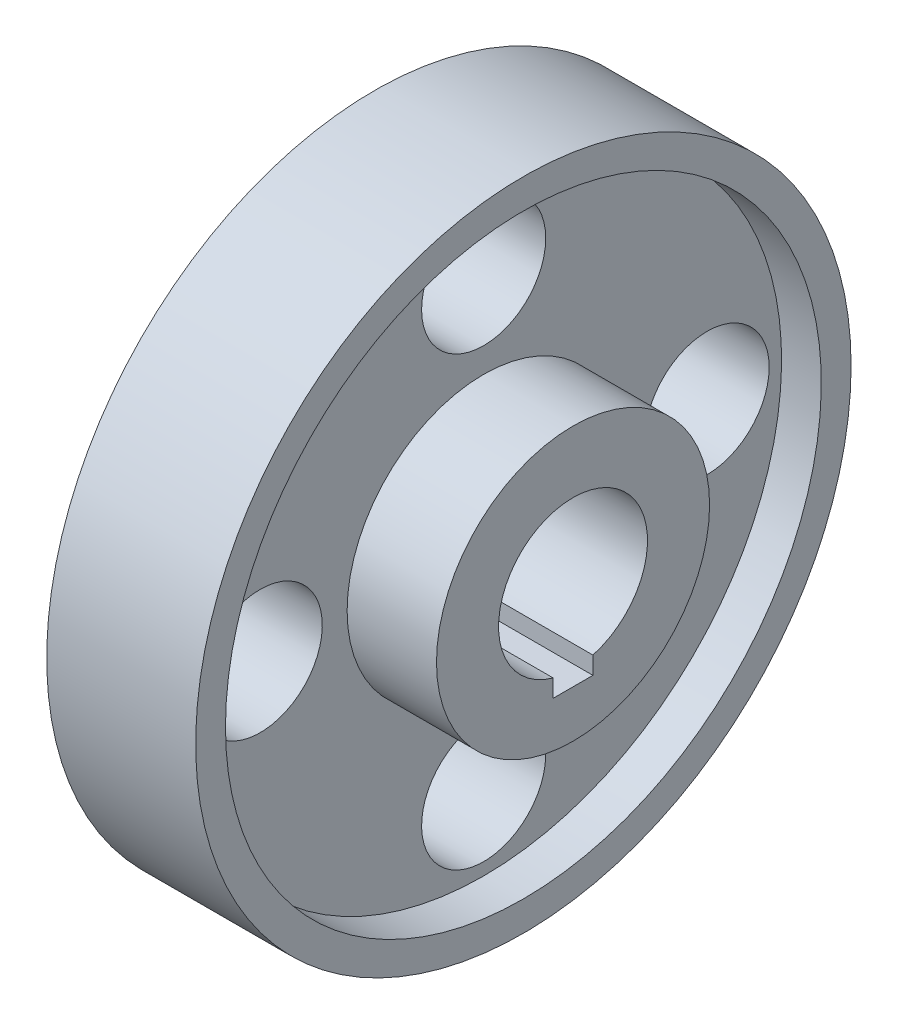
ISO-10303-21;
HEADER;
FILE_DESCRIPTION(('STEP AP214'),'2;1');
FILE_NAME('part.step','',(''),(''),'','','');
FILE_SCHEMA(('AUTOMOTIVE_DESIGN { 1 0 10303 214 1 1 1 1 }'));
ENDSEC;
DATA;
#1=APPLICATION_CONTEXT('core data for automotive mechanical design processes');
#2=APPLICATION_PROTOCOL_DEFINITION('international standard','automotive_design',2000,#1);
#3=PRODUCT_CONTEXT('',#1,'mechanical');
#4=PRODUCT('Part','Part','',(#3));
#5=PRODUCT_RELATED_PRODUCT_CATEGORY('part','',(#4));
#6=PRODUCT_DEFINITION_FORMATION('','',#4);
#7=PRODUCT_DEFINITION_CONTEXT('part definition',#1,'design');
#8=PRODUCT_DEFINITION('design','',#6,#7);
#9=PRODUCT_DEFINITION_SHAPE('','',#8);
#10=(LENGTH_UNIT() NAMED_UNIT(*) SI_UNIT(.MILLI.,.METRE.));
#11=(NAMED_UNIT(*) PLANE_ANGLE_UNIT() SI_UNIT($,.RADIAN.));
#12=(NAMED_UNIT(*) SI_UNIT($,.STERADIAN.) SOLID_ANGLE_UNIT());
#13=UNCERTAINTY_MEASURE_WITH_UNIT(LENGTH_MEASURE(1.E-05),#10,'distance_accuracy_value','');
#14=(GEOMETRIC_REPRESENTATION_CONTEXT(3) GLOBAL_UNCERTAINTY_ASSIGNED_CONTEXT((#13)) GLOBAL_UNIT_ASSIGNED_CONTEXT((#10,
#11,#12)) REPRESENTATION_CONTEXT('',''));
#15=CARTESIAN_POINT('',(0.,0.,0.));
#16=DIRECTION('',(0.,0.,1.));
#17=DIRECTION('',(1.,0.,0.));
#18=AXIS2_PLACEMENT_3D('',#15,#16,#17);
#19=CARTESIAN_POINT('',(504.152262189073,978.585270427388,20.));
#20=DIRECTION('',(-1.,0.,0.));
#21=DIRECTION('',(0.,0.,-1.));
#22=AXIS2_PLACEMENT_3D('',#19,#20,#21);
#23=CYLINDRICAL_SURFACE('',#22,27.5);
#24=CARTESIAN_POINT('',(544.152262189073,978.585270427388,20.));
#25=DIRECTION('',(1.,0.,0.));
#26=DIRECTION('',(0.,0.,1.));
#27=AXIS2_PLACEMENT_3D('',#24,#25,#26);
#28=CIRCLE('',#27,27.5);
#29=CARTESIAN_POINT('',(544.152262189073,978.585270427388,47.5));
#30=VERTEX_POINT('',#29);
#31=EDGE_CURVE('E120',#30,#30,#28,.T.);
#32=ORIENTED_EDGE('',*,*,#31,.F.);
#33=EDGE_LOOP('',(#32));
#34=FACE_BOUND('',#33,.T.);
#35=CARTESIAN_POINT('',(526.152262189073,978.585270427388,20.));
#36=DIRECTION('',(1.,0.,0.));
#37=DIRECTION('',(0.,0.,-1.));
#38=AXIS2_PLACEMENT_3D('',#35,#36,#37);
#39=CIRCLE('',#38,27.5);
#40=CARTESIAN_POINT('',(526.152262189073,1006.08527042739,20.));
#41=VERTEX_POINT('',#40);
#42=EDGE_CURVE('E87',#41,#41,#39,.T.);
#43=ORIENTED_EDGE('',*,*,#42,.T.);
#44=EDGE_LOOP('',(#43));
#45=FACE_BOUND('',#44,.T.);
#46=ADVANCED_FACE('F42',(#34,#45),#23,.T.);
#47=CARTESIAN_POINT('',(504.152262189073,978.585270427388,20.));
#48=DIRECTION('',(-1.,0.,0.));
#49=DIRECTION('',(0.,-0.963788819653398,0.266666666666665));
#50=AXIS2_PLACEMENT_3D('',#47,#48,#49);
#51=CYLINDRICAL_SURFACE('',#50,15.);
#52=CARTESIAN_POINT('',(504.152262189073,978.585270427388,20.));
#53=DIRECTION('',(-1.,0.,0.));
#54=DIRECTION('',(0.,-0.963788819653398,0.266666666666665));
#55=AXIS2_PLACEMENT_3D('',#52,#53,#54);
#56=CIRCLE('',#55,15.);
#57=CARTESIAN_POINT('',(504.152262189073,964.128438132587,24.));
#58=VERTEX_POINT('',#57);
#59=CARTESIAN_POINT('',(504.152262189073,964.128438132587,16.));
#60=VERTEX_POINT('',#59);
#61=EDGE_CURVE('E128',#58,#60,#56,.T.);
#62=ORIENTED_EDGE('',*,*,#61,.T.);
#63=DIRECTION('',(1.,0.,0.));
#64=VECTOR('',#63,1.);
#65=CARTESIAN_POINT('',(504.152262189073,964.128438132587,16.));
#66=LINE('',#65,#64);
#67=CARTESIAN_POINT('',(544.152262189073,964.128438132587,16.));
#68=VERTEX_POINT('',#67);
#69=EDGE_CURVE('E144',#60,#68,#66,.T.);
#70=ORIENTED_EDGE('',*,*,#69,.T.);
#71=CARTESIAN_POINT('',(544.152262189073,978.585270427388,20.));
#72=DIRECTION('',(-1.,0.,0.));
#73=DIRECTION('',(0.,-0.963788819653398,0.266666666666665));
#74=AXIS2_PLACEMENT_3D('',#71,#72,#73);
#75=CIRCLE('',#74,15.);
#76=CARTESIAN_POINT('',(544.152262189073,964.128438132587,24.));
#77=VERTEX_POINT('',#76);
#78=EDGE_CURVE('E154',#77,#68,#75,.T.);
#79=ORIENTED_EDGE('',*,*,#78,.F.);
#80=DIRECTION('',(1.,0.,0.));
#81=VECTOR('',#80,1.);
#82=CARTESIAN_POINT('',(504.152262189073,964.128438132587,24.));
#83=LINE('',#82,#81);
#84=EDGE_CURVE('E151',#58,#77,#83,.T.);
#85=ORIENTED_EDGE('',*,*,#84,.F.);
#86=EDGE_LOOP('',(#62,#70,#79,#85));
#87=FACE_BOUND('',#86,.T.);
#88=ADVANCED_FACE('F205',(#87),#51,.F.);
#89=CARTESIAN_POINT('',(534.152262189073,978.585270427388,20.));
#90=DIRECTION('',(1.,0.,0.));
#91=DIRECTION('',(0.,0.,1.));
#92=AXIS2_PLACEMENT_3D('',#89,#90,#91);
#93=PLANE('',#92);
#94=CARTESIAN_POINT('',(534.152262189073,978.585270427388,20.));
#95=DIRECTION('',(1.,0.,0.));
#96=DIRECTION('',(0.,0.,-1.));
#97=AXIS2_PLACEMENT_3D('',#94,#95,#96);
#98=CIRCLE('',#97,66.);
#99=CARTESIAN_POINT('',(534.152262189073,978.585270427388,-46.));
#100=VERTEX_POINT('',#99);
#101=EDGE_CURVE('E11',#100,#100,#98,.T.);
#102=ORIENTED_EDGE('',*,*,#101,.T.);
#103=EDGE_LOOP('',(#102));
#104=FACE_BOUND('',#103,.T.);
#105=CARTESIAN_POINT('',(534.152262189073,978.585270427388,20.));
#106=DIRECTION('',(-1.,0.,0.));
#107=DIRECTION('',(0.,0.,-1.));
#108=AXIS2_PLACEMENT_3D('',#105,#106,#107);
#109=CIRCLE('',#108,60.);
#110=CARTESIAN_POINT('',(534.152262189073,978.585270427388,80.));
#111=VERTEX_POINT('',#110);
#112=EDGE_CURVE('E52',#111,#111,#109,.T.);
#113=ORIENTED_EDGE('',*,*,#112,.T.);
#114=EDGE_LOOP('',(#113));
#115=FACE_BOUND('',#114,.T.);
#116=ADVANCED_FACE('F211',(#104,#115),#93,.T.);
#117=CARTESIAN_POINT('',(504.152262189073,978.585270427388,20.));
#118=DIRECTION('',(-1.,0.,0.));
#119=DIRECTION('',(0.,0.,1.));
#120=AXIS2_PLACEMENT_3D('',#117,#118,#119);
#121=CYLINDRICAL_SURFACE('',#120,66.);
#122=CARTESIAN_POINT('',(504.152262189073,978.585270427388,20.));
#123=DIRECTION('',(1.,0.,0.));
#124=DIRECTION('',(0.,0.,1.));
#125=AXIS2_PLACEMENT_3D('',#122,#123,#124);
#126=CIRCLE('',#125,66.);
#127=CARTESIAN_POINT('',(504.152262189073,978.585270427388,-46.));
#128=VERTEX_POINT('',#127);
#129=EDGE_CURVE('E124',#128,#128,#126,.T.);
#130=ORIENTED_EDGE('',*,*,#129,.T.);
#131=EDGE_LOOP('',(#130));
#132=FACE_BOUND('',#131,.T.);
#133=ORIENTED_EDGE('',*,*,#101,.F.);
#134=EDGE_LOOP('',(#133));
#135=FACE_BOUND('',#134,.T.);
#136=ADVANCED_FACE('F125',(#132,#135),#121,.T.);
#137=CARTESIAN_POINT('',(504.152262189073,978.585270427388,20.));
#138=DIRECTION('',(-1.,0.,0.));
#139=DIRECTION('',(0.,0.,-1.));
#140=AXIS2_PLACEMENT_3D('',#137,#138,#139);
#141=CYLINDRICAL_SURFACE('',#140,60.);
#142=ORIENTED_EDGE('',*,*,#112,.F.);
#143=EDGE_LOOP('',(#142));
#144=FACE_BOUND('',#143,.T.);
#145=CARTESIAN_POINT('',(526.152262189073,978.585270427388,20.));
#146=DIRECTION('',(-1.,0.,0.));
#147=DIRECTION('',(0.,0.,-1.));
#148=AXIS2_PLACEMENT_3D('',#145,#146,#147);
#149=CIRCLE('',#148,60.);
#150=CARTESIAN_POINT('',(526.152262189073,918.585270427388,20.));
#151=VERTEX_POINT('',#150);
#152=EDGE_CURVE('E162',#151,#151,#149,.T.);
#153=ORIENTED_EDGE('',*,*,#152,.T.);
#154=EDGE_LOOP('',(#153));
#155=FACE_BOUND('',#154,.T.);
#156=ADVANCED_FACE('F216',(#144,#155),#141,.F.);
#157=CARTESIAN_POINT('',(504.152262189073,978.585270427388,20.));
#158=DIRECTION('',(1.,0.,0.));
#159=DIRECTION('',(0.,0.,1.));
#160=AXIS2_PLACEMENT_3D('',#157,#158,#159);
#161=PLANE('',#160);
#162=ORIENTED_EDGE('',*,*,#129,.F.);
#163=EDGE_LOOP('',(#162));
#164=FACE_BOUND('',#163,.T.);
#165=DIRECTION('',(0.,1.,0.));
#166=VECTOR('',#165,1.);
#167=CARTESIAN_POINT('',(504.152262189073,971.275570419888,16.0000000000004));
#168=LINE('',#167,#166);
#169=CARTESIAN_POINT('',(504.152262189073,960.585270427388,16.0000000000002));
#170=VERTEX_POINT('',#169);
#171=EDGE_CURVE('E141',#170,#60,#168,.T.);
#172=ORIENTED_EDGE('',*,*,#171,.T.);
#173=ORIENTED_EDGE('',*,*,#61,.F.);
#174=DIRECTION('',(0.,-1.,0.));
#175=VECTOR('',#174,1.);
#176=CARTESIAN_POINT('',(504.152262189073,971.275570419888,24.0000000000004));
#177=LINE('',#176,#175);
#178=CARTESIAN_POINT('',(504.152262189073,960.585270427388,24.0000000000002));
#179=VERTEX_POINT('',#178);
#180=EDGE_CURVE('E155',#58,#179,#177,.T.);
#181=ORIENTED_EDGE('',*,*,#180,.T.);
#182=DIRECTION('',(0.,0.,-1.));
#183=VECTOR('',#182,1.);
#184=CARTESIAN_POINT('',(504.152262189073,960.585270427388,18.0000000000002));
#185=LINE('',#184,#183);
#186=EDGE_CURVE('E134',#179,#170,#185,.T.);
#187=ORIENTED_EDGE('',*,*,#186,.T.);
#188=EDGE_LOOP('',(#172,#173,#181,#187));
#189=FACE_BOUND('',#188,.T.);
#190=CARTESIAN_POINT('',(504.152262189073,978.585270427388,65.));
#191=DIRECTION('',(1.,0.,0.));
#192=DIRECTION('',(0.,1.,0.));
#193=AXIS2_PLACEMENT_3D('',#190,#191,#192);
#194=CIRCLE('',#193,12.5);
#195=CARTESIAN_POINT('',(504.152262189073,991.085270427388,65.));
#196=VERTEX_POINT('',#195);
#197=EDGE_CURVE('E140',#196,#196,#194,.T.);
#198=ORIENTED_EDGE('',*,*,#197,.T.);
#199=EDGE_LOOP('',(#198));
#200=FACE_BOUND('',#199,.T.);
#201=CARTESIAN_POINT('',(504.152262189073,978.585270427388,-25.));
#202=DIRECTION('',(1.,0.,0.));
#203=DIRECTION('',(0.,1.,0.));
#204=AXIS2_PLACEMENT_3D('',#201,#202,#203);
#205=CIRCLE('',#204,12.5);
#206=CARTESIAN_POINT('',(504.152262189073,991.085270427388,-25.));
#207=VERTEX_POINT('',#206);
#208=EDGE_CURVE('E142',#207,#207,#205,.T.);
#209=ORIENTED_EDGE('',*,*,#208,.T.);
#210=EDGE_LOOP('',(#209));
#211=FACE_BOUND('',#210,.T.);
#212=CARTESIAN_POINT('',(504.152262189073,1023.58527042739,20.));
#213=DIRECTION('',(1.,0.,0.));
#214=DIRECTION('',(0.,-1.,0.));
#215=AXIS2_PLACEMENT_3D('',#212,#213,#214);
#216=CIRCLE('',#215,12.5);
#217=CARTESIAN_POINT('',(504.152262189073,1011.08527042739,20.));
#218=VERTEX_POINT('',#217);
#219=EDGE_CURVE('E174',#218,#218,#216,.T.);
#220=ORIENTED_EDGE('',*,*,#219,.T.);
#221=EDGE_LOOP('',(#220));
#222=FACE_BOUND('',#221,.T.);
#223=CARTESIAN_POINT('',(504.152262189073,933.585270427388,20.));
#224=DIRECTION('',(1.,0.,0.));
#225=DIRECTION('',(0.,1.,0.));
#226=AXIS2_PLACEMENT_3D('',#223,#224,#225);
#227=CIRCLE('',#226,12.5);
#228=CARTESIAN_POINT('',(504.152262189073,946.085270427388,20.));
#229=VERTEX_POINT('',#228);
#230=EDGE_CURVE('E46',#229,#229,#227,.T.);
#231=ORIENTED_EDGE('',*,*,#230,.T.);
#232=EDGE_LOOP('',(#231));
#233=FACE_BOUND('',#232,.T.);
#234=ADVANCED_FACE('F44',(#164,#189,#200,#211,#222,#233),#161,.F.);
#235=CARTESIAN_POINT('',(544.152262189073,978.585270427388,20.));
#236=DIRECTION('',(1.,0.,0.));
#237=DIRECTION('',(0.,0.,1.));
#238=AXIS2_PLACEMENT_3D('',#235,#236,#237);
#239=PLANE('',#238);
#240=ORIENTED_EDGE('',*,*,#31,.T.);
#241=EDGE_LOOP('',(#240));
#242=FACE_BOUND('',#241,.T.);
#243=DIRECTION('',(0.,-1.,0.));
#244=VECTOR('',#243,1.);
#245=CARTESIAN_POINT('',(544.152262189073,971.275570419888,16.0000000000002));
#246=LINE('',#245,#244);
#247=CARTESIAN_POINT('',(544.152262189073,960.585270427388,16.0000000000002));
#248=VERTEX_POINT('',#247);
#249=EDGE_CURVE('E148',#68,#248,#246,.T.);
#250=ORIENTED_EDGE('',*,*,#249,.T.);
#251=DIRECTION('',(0.,0.,1.));
#252=VECTOR('',#251,1.);
#253=CARTESIAN_POINT('',(544.152262189073,960.585270427388,18.0000000000002));
#254=LINE('',#253,#252);
#255=CARTESIAN_POINT('',(544.152262189073,960.585270427388,24.0000000000002));
#256=VERTEX_POINT('',#255);
#257=EDGE_CURVE('E147',#248,#256,#254,.T.);
#258=ORIENTED_EDGE('',*,*,#257,.T.);
#259=DIRECTION('',(0.,1.,0.));
#260=VECTOR('',#259,1.);
#261=CARTESIAN_POINT('',(544.152262189073,971.275570419888,24.0000000000002));
#262=LINE('',#261,#260);
#263=EDGE_CURVE('E139',#256,#77,#262,.T.);
#264=ORIENTED_EDGE('',*,*,#263,.T.);
#265=ORIENTED_EDGE('',*,*,#78,.T.);
#266=EDGE_LOOP('',(#250,#258,#264,#265));
#267=FACE_BOUND('',#266,.T.);
#268=ADVANCED_FACE('F233',(#242,#267),#239,.T.);
#269=CARTESIAN_POINT('',(528.047078226648,963.965870412389,24.0000000000002));
#270=DIRECTION('',(0.,0.,1.));
#271=DIRECTION('',(1.,0.,0.));
#272=AXIS2_PLACEMENT_3D('',#269,#270,#271);
#273=PLANE('',#272);
#274=ORIENTED_EDGE('',*,*,#263,.F.);
#275=DIRECTION('',(1.,0.,0.));
#276=VECTOR('',#275,1.);
#277=CARTESIAN_POINT('',(504.152262189073,960.585270427388,24.0000000000002));
#278=LINE('',#277,#276);
#279=EDGE_CURVE('E136',#179,#256,#278,.T.);
#280=ORIENTED_EDGE('',*,*,#279,.F.);
#281=ORIENTED_EDGE('',*,*,#180,.F.);
#282=ORIENTED_EDGE('',*,*,#84,.T.);
#283=EDGE_LOOP('',(#274,#280,#281,#282));
#284=FACE_BOUND('',#283,.T.);
#285=ADVANCED_FACE('F224',(#284),#273,.F.);
#286=CARTESIAN_POINT('',(504.152262189073,960.585270427388,16.0000000000002));
#287=DIRECTION('',(0.,-1.,0.));
#288=DIRECTION('',(1.,0.,0.));
#289=AXIS2_PLACEMENT_3D('',#286,#287,#288);
#290=PLANE('',#289);
#291=ORIENTED_EDGE('',*,*,#257,.F.);
#292=DIRECTION('',(1.,0.,0.));
#293=VECTOR('',#292,1.);
#294=CARTESIAN_POINT('',(504.152262189073,960.585270427388,16.0000000000002));
#295=LINE('',#294,#293);
#296=EDGE_CURVE('E165',#170,#248,#295,.T.);
#297=ORIENTED_EDGE('',*,*,#296,.F.);
#298=ORIENTED_EDGE('',*,*,#186,.F.);
#299=ORIENTED_EDGE('',*,*,#279,.T.);
#300=EDGE_LOOP('',(#291,#297,#298,#299));
#301=FACE_BOUND('',#300,.T.);
#302=ADVANCED_FACE('F221',(#301),#290,.F.);
#303=CARTESIAN_POINT('',(528.047078226648,963.965870412389,16.0000000000002));
#304=DIRECTION('',(0.,0.,1.));
#305=DIRECTION('',(1.,0.,0.));
#306=AXIS2_PLACEMENT_3D('',#303,#304,#305);
#307=PLANE('',#306);
#308=ORIENTED_EDGE('',*,*,#171,.F.);
#309=ORIENTED_EDGE('',*,*,#296,.T.);
#310=ORIENTED_EDGE('',*,*,#249,.F.);
#311=ORIENTED_EDGE('',*,*,#69,.F.);
#312=EDGE_LOOP('',(#308,#309,#310,#311));
#313=FACE_BOUND('',#312,.T.);
#314=ADVANCED_FACE('F223',(#313),#307,.T.);
#315=CARTESIAN_POINT('',(504.152262189073,978.585270427388,65.));
#316=DIRECTION('',(-1.,0.,0.));
#317=DIRECTION('',(0.,1.,0.));
#318=AXIS2_PLACEMENT_3D('',#315,#316,#317);
#319=CYLINDRICAL_SURFACE('',#318,12.5);
#320=ORIENTED_EDGE('',*,*,#197,.F.);
#321=EDGE_LOOP('',(#320));
#322=FACE_BOUND('',#321,.T.);
#323=CARTESIAN_POINT('',(526.152262189073,978.585270427388,65.));
#324=DIRECTION('',(-1.,0.,0.));
#325=DIRECTION('',(0.,-1.,0.));
#326=AXIS2_PLACEMENT_3D('',#323,#324,#325);
#327=CIRCLE('',#326,12.5);
#328=CARTESIAN_POINT('',(526.152262189073,991.085270427388,65.));
#329=VERTEX_POINT('',#328);
#330=EDGE_CURVE('E159',#329,#329,#327,.T.);
#331=ORIENTED_EDGE('',*,*,#330,.F.);
#332=EDGE_LOOP('',(#331));
#333=FACE_BOUND('',#332,.T.);
#334=ADVANCED_FACE('F227',(#322,#333),#319,.F.);
#335=CARTESIAN_POINT('',(504.152262189073,978.585270427388,-25.));
#336=DIRECTION('',(-1.,0.,0.));
#337=DIRECTION('',(0.,1.,0.));
#338=AXIS2_PLACEMENT_3D('',#335,#336,#337);
#339=CYLINDRICAL_SURFACE('',#338,12.5);
#340=ORIENTED_EDGE('',*,*,#208,.F.);
#341=EDGE_LOOP('',(#340));
#342=FACE_BOUND('',#341,.T.);
#343=CARTESIAN_POINT('',(526.152262189073,978.585270427388,-25.));
#344=DIRECTION('',(-1.,0.,0.));
#345=DIRECTION('',(0.,1.,0.));
#346=AXIS2_PLACEMENT_3D('',#343,#344,#345);
#347=CIRCLE('',#346,12.5);
#348=CARTESIAN_POINT('',(526.152262189073,966.085270427388,-25.));
#349=VERTEX_POINT('',#348);
#350=EDGE_CURVE('E160',#349,#349,#347,.T.);
#351=ORIENTED_EDGE('',*,*,#350,.F.);
#352=EDGE_LOOP('',(#351));
#353=FACE_BOUND('',#352,.T.);
#354=ADVANCED_FACE('F199',(#342,#353),#339,.F.);
#355=CARTESIAN_POINT('',(504.152262189073,1023.58527042739,20.));
#356=DIRECTION('',(-1.,0.,0.));
#357=DIRECTION('',(0.,-1.,0.));
#358=AXIS2_PLACEMENT_3D('',#355,#356,#357);
#359=CYLINDRICAL_SURFACE('',#358,12.5);
#360=ORIENTED_EDGE('',*,*,#219,.F.);
#361=EDGE_LOOP('',(#360));
#362=FACE_BOUND('',#361,.T.);
#363=CARTESIAN_POINT('',(526.152262189073,1023.58527042739,20.));
#364=DIRECTION('',(-1.,0.,0.));
#365=DIRECTION('',(0.,-1.,0.));
#366=AXIS2_PLACEMENT_3D('',#363,#364,#365);
#367=CIRCLE('',#366,12.5);
#368=CARTESIAN_POINT('',(526.152262189073,1036.08527042739,20.));
#369=VERTEX_POINT('',#368);
#370=EDGE_CURVE('E157',#369,#369,#367,.T.);
#371=ORIENTED_EDGE('',*,*,#370,.F.);
#372=EDGE_LOOP('',(#371));
#373=FACE_BOUND('',#372,.T.);
#374=ADVANCED_FACE('F191',(#362,#373),#359,.F.);
#375=CARTESIAN_POINT('',(504.152262189073,933.585270427388,20.));
#376=DIRECTION('',(-1.,0.,0.));
#377=DIRECTION('',(0.,1.,0.));
#378=AXIS2_PLACEMENT_3D('',#375,#376,#377);
#379=CYLINDRICAL_SURFACE('',#378,12.5);
#380=ORIENTED_EDGE('',*,*,#230,.F.);
#381=EDGE_LOOP('',(#380));
#382=FACE_BOUND('',#381,.T.);
#383=CARTESIAN_POINT('',(526.152262189073,933.585270427388,20.));
#384=DIRECTION('',(-1.,0.,0.));
#385=DIRECTION('',(0.,-1.,0.));
#386=AXIS2_PLACEMENT_3D('',#383,#384,#385);
#387=CIRCLE('',#386,12.5);
#388=CARTESIAN_POINT('',(526.152262189073,946.085270427388,20.));
#389=VERTEX_POINT('',#388);
#390=EDGE_CURVE('E82',#389,#389,#387,.T.);
#391=ORIENTED_EDGE('',*,*,#390,.F.);
#392=EDGE_LOOP('',(#391));
#393=FACE_BOUND('',#392,.T.);
#394=ADVANCED_FACE('F187',(#382,#393),#379,.F.);
#395=CARTESIAN_POINT('',(526.152262189073,978.585270427388,20.));
#396=DIRECTION('',(1.,0.,0.));
#397=DIRECTION('',(0.,1.,0.));
#398=AXIS2_PLACEMENT_3D('',#395,#396,#397);
#399=PLANE('',#398);
#400=ORIENTED_EDGE('',*,*,#152,.F.);
#401=EDGE_LOOP('',(#400));
#402=FACE_BOUND('',#401,.T.);
#403=ORIENTED_EDGE('',*,*,#330,.T.);
#404=EDGE_LOOP('',(#403));
#405=FACE_BOUND('',#404,.T.);
#406=ORIENTED_EDGE('',*,*,#370,.T.);
#407=EDGE_LOOP('',(#406));
#408=FACE_BOUND('',#407,.T.);
#409=ORIENTED_EDGE('',*,*,#350,.T.);
#410=EDGE_LOOP('',(#409));
#411=FACE_BOUND('',#410,.T.);
#412=ORIENTED_EDGE('',*,*,#42,.F.);
#413=EDGE_LOOP('',(#412));
#414=FACE_BOUND('',#413,.T.);
#415=ORIENTED_EDGE('',*,*,#390,.T.);
#416=EDGE_LOOP('',(#415));
#417=FACE_BOUND('',#416,.T.);
#418=ADVANCED_FACE('F190',(#402,#405,#408,#411,#414,#417),#399,.T.);
#419=CLOSED_SHELL('',(#46,#88,#116,#136,#156,#234,#268,#285,#302,#314,#334,#354,#374,#394,#418));
#420=MANIFOLD_SOLID_BREP('B2',#419);
#421=ADVANCED_BREP_SHAPE_REPRESENTATION('',(#18,#420),#14);
#422=SHAPE_DEFINITION_REPRESENTATION(#9,#421);
ENDSEC;
END-ISO-10303-21;
